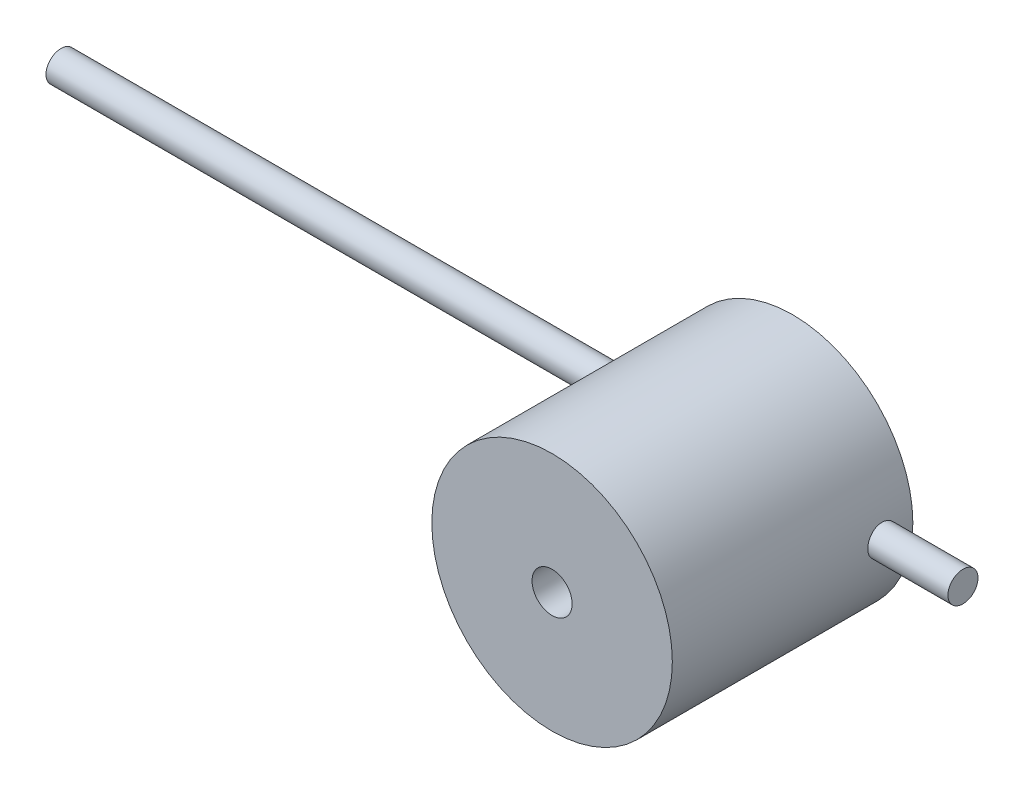
ISO-10303-21;
HEADER;
FILE_DESCRIPTION(('STEP AP214'),'2;1');
FILE_NAME('part.step','',(''),(''),'','','');
FILE_SCHEMA(('AUTOMOTIVE_DESIGN { 1 0 10303 214 1 1 1 1 }'));
ENDSEC;
DATA;
#1=APPLICATION_CONTEXT('core data for automotive mechanical design processes');
#2=APPLICATION_PROTOCOL_DEFINITION('international standard','automotive_design',2000,#1);
#3=PRODUCT_CONTEXT('',#1,'mechanical');
#4=PRODUCT('Part','Part','',(#3));
#5=PRODUCT_RELATED_PRODUCT_CATEGORY('part','',(#4));
#6=PRODUCT_DEFINITION_FORMATION('','',#4);
#7=PRODUCT_DEFINITION_CONTEXT('part definition',#1,'design');
#8=PRODUCT_DEFINITION('design','',#6,#7);
#9=PRODUCT_DEFINITION_SHAPE('','',#8);
#10=(LENGTH_UNIT() NAMED_UNIT(*) SI_UNIT(.MILLI.,.METRE.));
#11=(NAMED_UNIT(*) PLANE_ANGLE_UNIT() SI_UNIT($,.RADIAN.));
#12=(NAMED_UNIT(*) SI_UNIT($,.STERADIAN.) SOLID_ANGLE_UNIT());
#13=UNCERTAINTY_MEASURE_WITH_UNIT(LENGTH_MEASURE(1.E-05),#10,'distance_accuracy_value','');
#14=(GEOMETRIC_REPRESENTATION_CONTEXT(3) GLOBAL_UNCERTAINTY_ASSIGNED_CONTEXT((#13)) GLOBAL_UNIT_ASSIGNED_CONTEXT((#10,
#11,#12)) REPRESENTATION_CONTEXT('',''));
#15=CARTESIAN_POINT('',(0.,0.,0.));
#16=DIRECTION('',(0.,0.,1.));
#17=DIRECTION('',(1.,0.,0.));
#18=AXIS2_PLACEMENT_3D('',#15,#16,#17);
#19=CARTESIAN_POINT('',(0.,0.,120.));
#20=DIRECTION('',(0.,0.,-1.));
#21=DIRECTION('',(-1.,0.,0.));
#22=AXIS2_PLACEMENT_3D('',#19,#20,#21);
#23=CYLINDRICAL_SURFACE('',#22,60.);
#24=CARTESIAN_POINT('',(-60.,0.,22.5));
#25=CARTESIAN_POINT('',(-60.0000008072456,-0.209835179857693,22.5000024081655));
#26=CARTESIAN_POINT('',(-59.9988970627432,-0.419635008083124,22.4911906957988));
#27=CARTESIAN_POINT('',(-59.994514648571,-0.837801219709847,22.4560115216013));
#28=CARTESIAN_POINT('',(-59.9912354859298,-1.04616726738617,22.4296400805553));
#29=CARTESIAN_POINT('',(-59.9825900581494,-1.46006185394668,22.3595051153471));
#30=CARTESIAN_POINT('',(-59.977222238961,-1.66558816175998,22.3157286405702));
#31=CARTESIAN_POINT('',(-59.9645488785549,-2.07226432319807,22.2110899652084));
#32=CARTESIAN_POINT('',(-59.9572426276364,-2.27341254466818,22.1502215064098));
#33=CARTESIAN_POINT('',(-59.940907480883,-2.66962301929384,22.0119252044326));
#34=CARTESIAN_POINT('',(-59.9318803976571,-2.86469142718654,21.9345147751655));
#35=CARTESIAN_POINT('',(-59.9123479560362,-3.2476673905735,21.7636263282448));
#36=CARTESIAN_POINT('',(-59.9018420534441,-3.43557227743676,21.6701423928142));
#37=CARTESIAN_POINT('',(-59.879654390666,-3.80273620040454,21.4678517612572));
#38=CARTESIAN_POINT('',(-59.8679732777265,-3.98199991602831,21.3590534864614));
#39=CARTESIAN_POINT('',(-59.8437516261297,-4.3308167277805,21.1268217112452));
#40=CARTESIAN_POINT('',(-59.8312107700279,-4.50036619421962,21.0033827926191));
#41=CARTESIAN_POINT('',(-59.8055648124258,-4.82926021024783,20.7421726246075));
#42=CARTESIAN_POINT('',(-59.7924574043078,-4.9885548453394,20.6043387500643));
#43=CARTESIAN_POINT('',(-59.7660958398318,-5.29504112974239,20.3157186594682));
#44=CARTESIAN_POINT('',(-59.7528416309941,-5.4422282811684,20.1649276720497));
#45=CARTESIAN_POINT('',(-59.7265690908328,-5.72336233151058,19.851538085621));
#46=CARTESIAN_POINT('',(-59.713550686116,-5.85731341001309,19.6889432422568));
#47=CARTESIAN_POINT('',(-59.6881086091899,-6.11113500812857,19.3529726204506));
#48=CARTESIAN_POINT('',(-59.6756851581607,-6.23100031491878,19.1795928868416));
#49=CARTESIAN_POINT('',(-59.6517527193942,-6.45610218120676,18.8227461899607));
#50=CARTESIAN_POINT('',(-59.6402467724814,-6.56129089761476,18.6392488374808));
#51=CARTESIAN_POINT('',(-59.6185237847686,-6.75582760386391,18.2639645314929));
#52=CARTESIAN_POINT('',(-59.6083067586298,-6.84517541352051,18.0721774837235));
#53=CARTESIAN_POINT('',(-59.5894571244349,-7.00737256545688,17.6816833496951));
#54=CARTESIAN_POINT('',(-59.580824444309,-7.08022265822985,17.4829765786939));
#55=CARTESIAN_POINT('',(-59.5653933051776,-7.20889193973476,17.0800491725216));
#56=CARTESIAN_POINT('',(-59.5585948786415,-7.26471082698702,16.875828439814));
#57=CARTESIAN_POINT('',(-59.5470621441925,-7.35864259084453,16.4644613909454));
#58=CARTESIAN_POINT('',(-59.5423168587649,-7.39684970581958,16.2573369041406));
#59=CARTESIAN_POINT('',(-59.534972875091,-7.4557281728748,15.8405025481861));
#60=CARTESIAN_POINT('',(-59.5323749194834,-7.47639345830551,15.6307918100268));
#61=CARTESIAN_POINT('',(-59.529405895952,-7.49999961317464,15.2104278964538));
#62=CARTESIAN_POINT('',(-59.5290339473656,-7.50294749205367,14.9997751267438));
#63=CARTESIAN_POINT('',(-59.5305203499227,-7.49113569056481,14.5789534994092));
#64=CARTESIAN_POINT('',(-59.532379522847,-7.47636948563487,14.3687848486724));
#65=CARTESIAN_POINT('',(-59.5412131240585,-7.40585434457932,13.7438353326807));
#66=CARTESIAN_POINT('',(-59.5514243347812,-7.32404699514045,13.3317219858392));
#67=CARTESIAN_POINT('',(-59.5793747967333,-7.09305044334548,12.5273479905467));
#68=CARTESIAN_POINT('',(-59.5971142004878,-6.94385987576682,12.13508774451));
#69=CARTESIAN_POINT('',(-59.6381737977105,-6.58189686974764,11.3800140139334));
#70=CARTESIAN_POINT('',(-59.6615092825892,-6.36894981211383,11.0172849263981));
#71=CARTESIAN_POINT('',(-59.7111212566682,-5.8856443573775,10.3325750893944));
#72=CARTESIAN_POINT('',(-59.7373978803633,-5.61528333429471,10.0105962048202));
#73=CARTESIAN_POINT('',(-59.7901533200798,-5.02259734630539,9.41417317405978));
#74=CARTESIAN_POINT('',(-59.8166322779516,-4.69992602818961,9.14007307332733));
#75=CARTESIAN_POINT('',(-59.8666389703307,-4.01297150267218,8.64987301128228));
#76=CARTESIAN_POINT('',(-59.8901666980328,-3.64868819932049,8.43377318371211));
#77=CARTESIAN_POINT('',(-59.9316345685704,-2.88858501872626,8.06570612690976));
#78=CARTESIAN_POINT('',(-59.9495728337504,-2.4927545998868,7.91376044276152));
#79=CARTESIAN_POINT('',(-59.9778235716976,-1.68092380742017,7.67858851502524));
#80=CARTESIAN_POINT('',(-59.9881364014722,-1.26492437903667,7.59535905426251));
#81=CARTESIAN_POINT('',(-59.9999278970946,-0.427539542256187,7.50042765701667));
#82=CARTESIAN_POINT('',(-60.001465101621,-0.00620865829554948,7.48825173869244));
#83=CARTESIAN_POINT('',(-59.9956901228213,0.832488297188223,7.53452348637715));
#84=CARTESIAN_POINT('',(-59.9883781279523,1.24985445295551,7.59296964838118));
#85=CARTESIAN_POINT('',(-59.9657631270826,2.06737282520474,7.77842806320245));
#86=CARTESIAN_POINT('',(-59.9504864642922,2.46757711048676,7.90521432705758));
#87=CARTESIAN_POINT('',(-59.9136514531216,3.2410515654509,8.22353631902365));
#88=CARTESIAN_POINT('',(-59.8920928914514,3.61432082006805,8.41507424569011));
#89=CARTESIAN_POINT('',(-59.8449555870866,4.32540380634226,8.85854454603988));
#90=CARTESIAN_POINT('',(-59.8193566873232,4.66302478410743,9.11078325443115));
#91=CARTESIAN_POINT('',(-59.7670509035881,5.29142746605191,9.66830410979636));
#92=CARTESIAN_POINT('',(-59.7403439756681,5.58220731010574,9.97358836228121));
#93=CARTESIAN_POINT('',(-59.7016380435985,5.97763907410765,10.4653937662025));
#94=CARTESIAN_POINT('',(-59.6889214637685,6.10301121551393,10.6356038298914));
#95=CARTESIAN_POINT('',(-59.6643241588947,6.3389644858848,10.9860168100064));
#96=CARTESIAN_POINT('',(-59.6524431268586,6.44955106087969,11.1662160123022));
#97=CARTESIAN_POINT('',(-59.6298530585349,6.65517392472868,11.5354154663655));
#98=CARTESIAN_POINT('',(-59.6191444320137,6.75020478242911,11.7244187625516));
#99=CARTESIAN_POINT('',(-59.5992146694418,6.9239625838002,12.1097765980105));
#100=CARTESIAN_POINT('',(-59.5899930068333,7.00269530171975,12.3061285045402));
#101=CARTESIAN_POINT('',(-59.5733202297058,7.14314431617409,12.7043603211244));
#102=CARTESIAN_POINT('',(-59.565864856219,7.20490160362171,12.9062255974062));
#103=CARTESIAN_POINT('',(-59.5529117083577,7.31119531531366,13.3144979850567));
#104=CARTESIAN_POINT('',(-59.547413888697,7.35573213793778,13.5209049912399));
#105=CARTESIAN_POINT('',(-59.5385356216265,7.4272523237877,13.9367790558483));
#106=CARTESIAN_POINT('',(-59.5351551310154,7.45423604516084,14.1462460517494));
#107=CARTESIAN_POINT('',(-59.5306100233168,7.49044756561786,14.5667295608509));
#108=CARTESIAN_POINT('',(-59.5294453610939,7.49967572637343,14.7777460424012));
#109=CARTESIAN_POINT('',(-59.5293660224746,7.50030533841579,15.1983775271006));
#110=CARTESIAN_POINT('',(-59.530436183503,7.49182692324543,15.4079923574669));
#111=CARTESIAN_POINT('',(-59.5347642243482,7.45735539030996,15.82568027398));
#112=CARTESIAN_POINT('',(-59.5380213387001,7.43136840078462,16.033753873825));
#113=CARTESIAN_POINT('',(-59.5466296196732,7.36207293039528,16.4469906883013));
#114=CARTESIAN_POINT('',(-59.5519811660099,7.31876130858647,16.6521533681967));
#115=CARTESIAN_POINT('',(-59.5646246440456,7.21513769662506,17.0580730004122));
#116=CARTESIAN_POINT('',(-59.571916534734,7.15482606577807,17.2588300457513));
#117=CARTESIAN_POINT('',(-59.5882296253959,7.01766726108854,17.6544614075487));
#118=CARTESIAN_POINT('',(-59.5972502188397,6.94082588568978,17.8493377596216));
#119=CARTESIAN_POINT('',(-59.6167661080843,6.77115104009003,18.2319194119574));
#120=CARTESIAN_POINT('',(-59.6272613895109,6.67831772576611,18.4196247820957));
#121=CARTESIAN_POINT('',(-59.6494324317321,6.47730127639786,18.7866009062649));
#122=CARTESIAN_POINT('',(-59.6611084172704,6.36911521741458,18.9658700449306));
#123=CARTESIAN_POINT('',(-59.6853066624681,6.13821094064496,19.3146367258618));
#124=CARTESIAN_POINT('',(-59.6978286170115,6.01549795040788,19.4841377507564));
#125=CARTESIAN_POINT('',(-59.7234625843333,5.7554496986455,19.8134314802167));
#126=CARTESIAN_POINT('',(-59.7365781324208,5.61801751874011,19.9731473817028));
#127=CARTESIAN_POINT('',(-59.7629410448537,5.3302662011054,20.2803926701648));
#128=CARTESIAN_POINT('',(-59.7761883596875,5.17995175340545,20.4279264541806));
#129=CARTESIAN_POINT('',(-59.8024544864036,4.86734515160091,20.7099290359168));
#130=CARTESIAN_POINT('',(-59.8154731554797,4.70504581984004,20.8443898908543));
#131=CARTESIAN_POINT('',(-59.8409024794371,4.36974177688067,21.0991535565568));
#132=CARTESIAN_POINT('',(-59.8533133571354,4.1967410422719,21.2194615787939));
#133=CARTESIAN_POINT('',(-59.8772329933241,3.84043950279135,21.4455978230118));
#134=CARTESIAN_POINT('',(-59.8887377589692,3.65709862113597,21.5513633382413));
#135=CARTESIAN_POINT('',(-59.9104562841461,3.2821453310284,21.747016013278));
#136=CARTESIAN_POINT('',(-59.9206705169112,3.09053598936716,21.8369089983135));
#137=CARTESIAN_POINT('',(-59.9395148754504,2.70048792706706,22.000144229784));
#138=CARTESIAN_POINT('',(-59.9481462359873,2.50205467434842,22.0734993873387));
#139=CARTESIAN_POINT('',(-59.9635872434483,2.09970302756128,22.2031888157386));
#140=CARTESIAN_POINT('',(-59.9703973200369,1.89578593971624,22.2595271014923));
#141=CARTESIAN_POINT('',(-59.9839939841766,1.41313252163123,22.371135728674));
#142=CARTESIAN_POINT('',(-59.9899711348981,1.1327263466371,22.4194100878781));
#143=CARTESIAN_POINT('',(-59.9979735818365,0.568191833988667,22.483840475098));
#144=CARTESIAN_POINT('',(-59.9999989071945,0.284063523797303,22.4999967399557));
#145=CARTESIAN_POINT('',(-60.,0.,22.5));
#146=B_SPLINE_CURVE_WITH_KNOTS('',3,(#24,#25,#26,#27,#28,#29,#30,#31,#32,#33,#34,#35,#36,#37,
#38,#39,#40,#41,#42,#43,#44,#45,#46,#47,#48,#49,#50,#51,#52,#53,#54,#55,#56,#57,#58,#59,#60,#61,
#62,#63,#64,#65,#66,#67,#68,#69,#70,#71,#72,#73,#74,#75,#76,#77,#78,#79,#80,#81,#82,#83,#84,#85,
#86,#87,#88,#89,#90,#91,#92,#93,#94,#95,#96,#97,#98,#99,#100,#101,#102,#103,#104,#105,#106,#107,
#108,#109,#110,#111,#112,#113,#114,#115,#116,#117,#118,#119,#120,#121,#122,#123,#124,#125,#126,
#127,#128,#129,#130,#131,#132,#133,#134,#135,#136,#137,#138,#139,#140,#141,#142,#143,#144,#145),
.UNSPECIFIED.,.T.,.F.,(4,2,2,2,2,2,2,2,2,2,2,2,2,2,2,2,2,2,2,2,2,2,2,2,2,2,2,2,2,2,2,2,2,2,2,2,
2,2,2,2,2,2,2,2,2,2,2,2,2,2,2,2,2,2,2,2,2,2,2,2,4),(0.,0.629256956735979,1.25865655812087,
1.88852535779791,2.51862508473088,3.14806473809473,3.777736630198,4.40706360970477,
5.03662422138718,5.66904783479461,6.30170534005458,6.93416242680935,7.56685283927394,
8.20155979243648,8.83627396469675,9.47095925754273,10.1056557846852,10.7369155393907,
11.3683935195212,11.9996216550207,12.631082359814,13.8854341565249,15.1398113682614,
16.3976560518401,17.6555582786833,18.9221576073666,20.1887598566675,21.4557871352223,
22.7227550903875,23.9812616450318,25.239741398332,26.494084880076,27.7484709556426,
29.0093253511268,30.2702298045268,30.9049539441184,31.5394436451943,32.1741544029163,
32.8086399033805,33.4415795637905,34.0745045808413,34.7074166835062,35.3403158939383,
35.9689350363351,36.5973342676854,37.2258474790913,37.8543474074806,38.4826272238218,
39.1109009165237,39.739294425292,40.3674624887028,41.0000557512051,41.6324196768415,
42.2651654408618,42.8976774758577,43.5328366425547,44.1677622187433,44.8021903772161,
45.4364687335205,46.2883290686284,47.1401831220126),.UNSPECIFIED.);
#147=CARTESIAN_POINT('',(-60.,0.,22.5));
#148=VERTEX_POINT('',#147);
#149=EDGE_CURVE('E64',#148,#148,#146,.T.);
#150=ORIENTED_EDGE('',*,*,#149,.T.);
#151=EDGE_LOOP('',(#150));
#152=FACE_BOUND('',#151,.T.);
#153=CARTESIAN_POINT('',(0.,0.,120.));
#154=DIRECTION('',(0.,0.,1.));
#155=DIRECTION('',(1.,0.,0.));
#156=AXIS2_PLACEMENT_3D('',#153,#154,#155);
#157=CIRCLE('',#156,60.);
#158=CARTESIAN_POINT('',(60.,0.,120.));
#159=VERTEX_POINT('',#158);
#160=EDGE_CURVE('E53',#159,#159,#157,.T.);
#161=ORIENTED_EDGE('',*,*,#160,.F.);
#162=EDGE_LOOP('',(#161));
#163=FACE_BOUND('',#162,.T.);
#164=CARTESIAN_POINT('',(0.,0.,0.));
#165=DIRECTION('',(0.,0.,1.));
#166=DIRECTION('',(1.,0.,0.));
#167=AXIS2_PLACEMENT_3D('',#164,#165,#166);
#168=CIRCLE('',#167,60.);
#169=CARTESIAN_POINT('',(60.,0.,0.));
#170=VERTEX_POINT('',#169);
#171=EDGE_CURVE('E58',#170,#170,#168,.T.);
#172=ORIENTED_EDGE('',*,*,#171,.T.);
#173=EDGE_LOOP('',(#172));
#174=FACE_BOUND('',#173,.T.);
#175=CARTESIAN_POINT('',(60.,0.,22.5));
#176=CARTESIAN_POINT('',(60.0000008072456,-0.209835179857693,22.5000024081655));
#177=CARTESIAN_POINT('',(59.9988970627432,-0.419635008083124,22.4911906957988));
#178=CARTESIAN_POINT('',(59.994514648571,-0.837801219709847,22.4560115216013));
#179=CARTESIAN_POINT('',(59.9912354859298,-1.04616726738617,22.4296400805553));
#180=CARTESIAN_POINT('',(59.9825900581494,-1.46006185394668,22.3595051153471));
#181=CARTESIAN_POINT('',(59.977222238961,-1.66558816175998,22.3157286405702));
#182=CARTESIAN_POINT('',(59.9645488785549,-2.07226432319807,22.2110899652084));
#183=CARTESIAN_POINT('',(59.9572426276364,-2.27341254466818,22.1502215064098));
#184=CARTESIAN_POINT('',(59.940907480883,-2.66962301929384,22.0119252044326));
#185=CARTESIAN_POINT('',(59.9318803976571,-2.86469142718654,21.9345147751655));
#186=CARTESIAN_POINT('',(59.9123479560362,-3.2476673905735,21.7636263282448));
#187=CARTESIAN_POINT('',(59.9018420534441,-3.43557227743676,21.6701423928142));
#188=CARTESIAN_POINT('',(59.879654390666,-3.80273620040454,21.4678517612572));
#189=CARTESIAN_POINT('',(59.8679732777265,-3.98199991602831,21.3590534864614));
#190=CARTESIAN_POINT('',(59.8437516261297,-4.3308167277805,21.1268217112452));
#191=CARTESIAN_POINT('',(59.8312107700279,-4.50036619421962,21.0033827926191));
#192=CARTESIAN_POINT('',(59.8055648124258,-4.82926021024783,20.7421726246075));
#193=CARTESIAN_POINT('',(59.7924574043078,-4.9885548453394,20.6043387500643));
#194=CARTESIAN_POINT('',(59.7660958398318,-5.29504112974239,20.3157186594682));
#195=CARTESIAN_POINT('',(59.7528416309941,-5.4422282811684,20.1649276720497));
#196=CARTESIAN_POINT('',(59.7265690908328,-5.72336233151058,19.851538085621));
#197=CARTESIAN_POINT('',(59.713550686116,-5.85731341001309,19.6889432422568));
#198=CARTESIAN_POINT('',(59.6881086091899,-6.11113500812857,19.3529726204506));
#199=CARTESIAN_POINT('',(59.6756851581607,-6.23100031491878,19.1795928868416));
#200=CARTESIAN_POINT('',(59.6517527193942,-6.45610218120676,18.8227461899607));
#201=CARTESIAN_POINT('',(59.6402467724814,-6.56129089761476,18.6392488374808));
#202=CARTESIAN_POINT('',(59.6185237847686,-6.75582760386391,18.2639645314929));
#203=CARTESIAN_POINT('',(59.6083067586298,-6.84517541352051,18.0721774837235));
#204=CARTESIAN_POINT('',(59.5894571244349,-7.00737256545688,17.6816833496951));
#205=CARTESIAN_POINT('',(59.580824444309,-7.08022265822985,17.4829765786939));
#206=CARTESIAN_POINT('',(59.5653933051776,-7.20889193973476,17.0800491725216));
#207=CARTESIAN_POINT('',(59.5585948786415,-7.26471082698702,16.875828439814));
#208=CARTESIAN_POINT('',(59.5470621441925,-7.35864259084453,16.4644613909454));
#209=CARTESIAN_POINT('',(59.5423168587649,-7.39684970581958,16.2573369041406));
#210=CARTESIAN_POINT('',(59.534972875091,-7.4557281728748,15.8405025481861));
#211=CARTESIAN_POINT('',(59.5323749194834,-7.47639345830551,15.6307918100268));
#212=CARTESIAN_POINT('',(59.529405895952,-7.49999961317464,15.2104278964538));
#213=CARTESIAN_POINT('',(59.5290339473656,-7.50294749205367,14.9997751267438));
#214=CARTESIAN_POINT('',(59.5305203499227,-7.49113569056481,14.5789534994092));
#215=CARTESIAN_POINT('',(59.532379522847,-7.47636948563487,14.3687848486724));
#216=CARTESIAN_POINT('',(59.5412131240585,-7.40585434457932,13.7438353326807));
#217=CARTESIAN_POINT('',(59.5514243347812,-7.32404699514045,13.3317219858392));
#218=CARTESIAN_POINT('',(59.5793747967333,-7.09305044334548,12.5273479905467));
#219=CARTESIAN_POINT('',(59.5971142004878,-6.94385987576682,12.13508774451));
#220=CARTESIAN_POINT('',(59.6381737977105,-6.58189686974764,11.3800140139334));
#221=CARTESIAN_POINT('',(59.6615092825892,-6.36894981211383,11.0172849263981));
#222=CARTESIAN_POINT('',(59.7111212566682,-5.8856443573775,10.3325750893944));
#223=CARTESIAN_POINT('',(59.7373978803633,-5.61528333429471,10.0105962048202));
#224=CARTESIAN_POINT('',(59.7901533200798,-5.02259734630539,9.41417317405978));
#225=CARTESIAN_POINT('',(59.8166322779516,-4.69992602818961,9.14007307332733));
#226=CARTESIAN_POINT('',(59.8666389703307,-4.01297150267218,8.64987301128228));
#227=CARTESIAN_POINT('',(59.8901666980328,-3.64868819932049,8.43377318371211));
#228=CARTESIAN_POINT('',(59.9316345685704,-2.88858501872626,8.06570612690976));
#229=CARTESIAN_POINT('',(59.9495728337504,-2.4927545998868,7.91376044276152));
#230=CARTESIAN_POINT('',(59.9778235716976,-1.68092380742017,7.67858851502524));
#231=CARTESIAN_POINT('',(59.9881364014722,-1.26492437903667,7.59535905426251));
#232=CARTESIAN_POINT('',(59.9999278970946,-0.427539542256187,7.50042765701667));
#233=CARTESIAN_POINT('',(60.001465101621,-0.00620865829554948,7.48825173869244));
#234=CARTESIAN_POINT('',(59.9956901228213,0.832488297188223,7.53452348637715));
#235=CARTESIAN_POINT('',(59.9883781279523,1.24985445295551,7.59296964838118));
#236=CARTESIAN_POINT('',(59.9657631270826,2.06737282520474,7.77842806320245));
#237=CARTESIAN_POINT('',(59.9504864642922,2.46757711048676,7.90521432705758));
#238=CARTESIAN_POINT('',(59.9136514531216,3.2410515654509,8.22353631902365));
#239=CARTESIAN_POINT('',(59.8920928914514,3.61432082006805,8.41507424569011));
#240=CARTESIAN_POINT('',(59.8449555870866,4.32540380634226,8.85854454603988));
#241=CARTESIAN_POINT('',(59.8193566873232,4.66302478410743,9.11078325443115));
#242=CARTESIAN_POINT('',(59.7670509035881,5.29142746605191,9.66830410979636));
#243=CARTESIAN_POINT('',(59.7403439756681,5.58220731010574,9.97358836228121));
#244=CARTESIAN_POINT('',(59.7016380435985,5.97763907410765,10.4653937662025));
#245=CARTESIAN_POINT('',(59.6889214637685,6.10301121551393,10.6356038298914));
#246=CARTESIAN_POINT('',(59.6643241588947,6.3389644858848,10.9860168100064));
#247=CARTESIAN_POINT('',(59.6524431268586,6.44955106087969,11.1662160123022));
#248=CARTESIAN_POINT('',(59.6298530585349,6.65517392472868,11.5354154663655));
#249=CARTESIAN_POINT('',(59.6191444320137,6.75020478242911,11.7244187625516));
#250=CARTESIAN_POINT('',(59.5992146694418,6.9239625838002,12.1097765980105));
#251=CARTESIAN_POINT('',(59.5899930068333,7.00269530171975,12.3061285045402));
#252=CARTESIAN_POINT('',(59.5733202297058,7.14314431617409,12.7043603211244));
#253=CARTESIAN_POINT('',(59.565864856219,7.20490160362171,12.9062255974062));
#254=CARTESIAN_POINT('',(59.5529117083577,7.31119531531366,13.3144979850567));
#255=CARTESIAN_POINT('',(59.547413888697,7.35573213793778,13.5209049912399));
#256=CARTESIAN_POINT('',(59.5385356216265,7.4272523237877,13.9367790558483));
#257=CARTESIAN_POINT('',(59.5351551310154,7.45423604516084,14.1462460517494));
#258=CARTESIAN_POINT('',(59.5306100233168,7.49044756561786,14.5667295608509));
#259=CARTESIAN_POINT('',(59.5294453610939,7.49967572637343,14.7777460424012));
#260=CARTESIAN_POINT('',(59.5293660224746,7.50030533841579,15.1983775271006));
#261=CARTESIAN_POINT('',(59.530436183503,7.49182692324543,15.4079923574669));
#262=CARTESIAN_POINT('',(59.5347642243482,7.45735539030996,15.82568027398));
#263=CARTESIAN_POINT('',(59.5380213387001,7.43136840078462,16.033753873825));
#264=CARTESIAN_POINT('',(59.5466296196732,7.36207293039528,16.4469906883013));
#265=CARTESIAN_POINT('',(59.5519811660099,7.31876130858647,16.6521533681967));
#266=CARTESIAN_POINT('',(59.5646246440456,7.21513769662506,17.0580730004122));
#267=CARTESIAN_POINT('',(59.571916534734,7.15482606577807,17.2588300457513));
#268=CARTESIAN_POINT('',(59.5882296253959,7.01766726108854,17.6544614075487));
#269=CARTESIAN_POINT('',(59.5972502188397,6.94082588568978,17.8493377596216));
#270=CARTESIAN_POINT('',(59.6167661080843,6.77115104009003,18.2319194119574));
#271=CARTESIAN_POINT('',(59.6272613895109,6.67831772576611,18.4196247820957));
#272=CARTESIAN_POINT('',(59.6494324317321,6.47730127639786,18.7866009062649));
#273=CARTESIAN_POINT('',(59.6611084172704,6.36911521741458,18.9658700449306));
#274=CARTESIAN_POINT('',(59.6853066624681,6.13821094064496,19.3146367258618));
#275=CARTESIAN_POINT('',(59.6978286170115,6.01549795040788,19.4841377507564));
#276=CARTESIAN_POINT('',(59.7234625843333,5.7554496986455,19.8134314802167));
#277=CARTESIAN_POINT('',(59.7365781324208,5.61801751874011,19.9731473817028));
#278=CARTESIAN_POINT('',(59.7629410448537,5.3302662011054,20.2803926701648));
#279=CARTESIAN_POINT('',(59.7761883596875,5.17995175340545,20.4279264541806));
#280=CARTESIAN_POINT('',(59.8024544864036,4.86734515160091,20.7099290359168));
#281=CARTESIAN_POINT('',(59.8154731554797,4.70504581984004,20.8443898908543));
#282=CARTESIAN_POINT('',(59.8409024794371,4.36974177688067,21.0991535565568));
#283=CARTESIAN_POINT('',(59.8533133571354,4.1967410422719,21.2194615787939));
#284=CARTESIAN_POINT('',(59.8772329933241,3.84043950279135,21.4455978230118));
#285=CARTESIAN_POINT('',(59.8887377589692,3.65709862113597,21.5513633382413));
#286=CARTESIAN_POINT('',(59.9104562841461,3.2821453310284,21.747016013278));
#287=CARTESIAN_POINT('',(59.9206705169112,3.09053598936716,21.8369089983135));
#288=CARTESIAN_POINT('',(59.9395148754504,2.70048792706706,22.000144229784));
#289=CARTESIAN_POINT('',(59.9481462359873,2.50205467434842,22.0734993873387));
#290=CARTESIAN_POINT('',(59.9635872434483,2.09970302756128,22.2031888157386));
#291=CARTESIAN_POINT('',(59.9703973200369,1.89578593971624,22.2595271014923));
#292=CARTESIAN_POINT('',(59.9839939841766,1.41313252163123,22.371135728674));
#293=CARTESIAN_POINT('',(59.9899711348981,1.1327263466371,22.4194100878781));
#294=CARTESIAN_POINT('',(59.9979735818365,0.568191833988667,22.483840475098));
#295=CARTESIAN_POINT('',(59.9999989071945,0.284063523797303,22.4999967399557));
#296=CARTESIAN_POINT('',(60.,0.,22.5));
#297=B_SPLINE_CURVE_WITH_KNOTS('',3,(#175,#176,#177,#178,#179,#180,#181,#182,#183,#184,#185,
#186,#187,#188,#189,#190,#191,#192,#193,#194,#195,#196,#197,#198,#199,#200,#201,#202,#203,#204,
#205,#206,#207,#208,#209,#210,#211,#212,#213,#214,#215,#216,#217,#218,#219,#220,#221,#222,#223,
#224,#225,#226,#227,#228,#229,#230,#231,#232,#233,#234,#235,#236,#237,#238,#239,#240,#241,#242,
#243,#244,#245,#246,#247,#248,#249,#250,#251,#252,#253,#254,#255,#256,#257,#258,#259,#260,#261,
#262,#263,#264,#265,#266,#267,#268,#269,#270,#271,#272,#273,#274,#275,#276,#277,#278,#279,#280,
#281,#282,#283,#284,#285,#286,#287,#288,#289,#290,#291,#292,#293,#294,#295,#296),.UNSPECIFIED.,
.T.,.F.,(4,2,2,2,2,2,2,2,2,2,2,2,2,2,2,2,2,2,2,2,2,2,2,2,2,2,2,2,2,2,2,2,2,2,2,2,2,2,2,2,2,2,2,
2,2,2,2,2,2,2,2,2,2,2,2,2,2,2,2,2,4),(0.,0.629256956735979,1.25865655812087,1.88852535779791,
2.51862508473088,3.14806473809473,3.777736630198,4.40706360970477,5.03662422138718,
5.66904783479461,6.30170534005458,6.93416242680935,7.56685283927394,8.20155979243648,
8.83627396469675,9.47095925754273,10.1056557846852,10.7369155393907,11.3683935195212,
11.9996216550207,12.631082359814,13.8854341565249,15.1398113682614,16.3976560518401,
17.6555582786833,18.9221576073666,20.1887598566675,21.4557871352223,22.7227550903875,
23.9812616450318,25.239741398332,26.494084880076,27.7484709556426,29.0093253511268,
30.2702298045268,30.9049539441184,31.5394436451943,32.1741544029163,32.8086399033805,
33.4415795637905,34.0745045808413,34.7074166835062,35.3403158939383,35.9689350363351,
36.5973342676854,37.2258474790913,37.8543474074806,38.4826272238218,39.1109009165237,
39.739294425292,40.3674624887028,41.0000557512051,41.6324196768415,42.2651654408618,
42.8976774758577,43.5328366425547,44.1677622187433,44.8021903772161,45.4364687335205,
46.2883290686284,47.1401831220126),.UNSPECIFIED.);
#298=CARTESIAN_POINT('',(60.,0.,22.5));
#299=VERTEX_POINT('',#298);
#300=EDGE_CURVE('E10',#299,#299,#297,.T.);
#301=ORIENTED_EDGE('',*,*,#300,.F.);
#302=EDGE_LOOP('',(#301));
#303=FACE_BOUND('',#302,.T.);
#304=ADVANCED_FACE('F41',(#152,#163,#174,#303),#23,.T.);
#305=CARTESIAN_POINT('',(0.,0.,120.));
#306=DIRECTION('',(0.,0.,1.));
#307=DIRECTION('',(1.,0.,0.));
#308=AXIS2_PLACEMENT_3D('',#305,#306,#307);
#309=PLANE('',#308);
#310=CARTESIAN_POINT('',(0.,0.,120.));
#311=DIRECTION('',(0.,0.,1.));
#312=DIRECTION('',(1.,0.,0.));
#313=AXIS2_PLACEMENT_3D('',#310,#311,#312);
#314=CIRCLE('',#313,10.);
#315=CARTESIAN_POINT('',(10.,0.,120.));
#316=VERTEX_POINT('',#315);
#317=EDGE_CURVE('E180',#316,#316,#314,.T.);
#318=ORIENTED_EDGE('',*,*,#317,.F.);
#319=EDGE_LOOP('',(#318));
#320=FACE_BOUND('',#319,.T.);
#321=ORIENTED_EDGE('',*,*,#160,.T.);
#322=EDGE_LOOP('',(#321));
#323=FACE_BOUND('',#322,.T.);
#324=ADVANCED_FACE('F84',(#320,#323),#309,.T.);
#325=CARTESIAN_POINT('',(0.,0.,0.));
#326=DIRECTION('',(0.,0.,1.));
#327=DIRECTION('',(1.,0.,0.));
#328=AXIS2_PLACEMENT_3D('',#325,#326,#327);
#329=PLANE('',#328);
#330=CARTESIAN_POINT('',(0.,0.,0.));
#331=DIRECTION('',(0.,0.,1.));
#332=DIRECTION('',(1.,0.,0.));
#333=AXIS2_PLACEMENT_3D('',#330,#331,#332);
#334=CIRCLE('',#333,10.);
#335=CARTESIAN_POINT('',(10.,0.,0.));
#336=VERTEX_POINT('',#335);
#337=EDGE_CURVE('E178',#336,#336,#334,.T.);
#338=ORIENTED_EDGE('',*,*,#337,.T.);
#339=EDGE_LOOP('',(#338));
#340=FACE_BOUND('',#339,.T.);
#341=ORIENTED_EDGE('',*,*,#171,.F.);
#342=EDGE_LOOP('',(#341));
#343=FACE_BOUND('',#342,.T.);
#344=ADVANCED_FACE('F81',(#340,#343),#329,.F.);
#345=CARTESIAN_POINT('',(-350.,0.,15.));
#346=DIRECTION('',(1.,0.,0.));
#347=DIRECTION('',(0.,0.,-1.));
#348=AXIS2_PLACEMENT_3D('',#345,#346,#347);
#349=CYLINDRICAL_SURFACE('',#348,7.5);
#350=CARTESIAN_POINT('',(-350.,0.,15.));
#351=DIRECTION('',(1.,0.,0.));
#352=DIRECTION('',(0.,0.,-1.));
#353=AXIS2_PLACEMENT_3D('',#350,#351,#352);
#354=CIRCLE('',#353,7.5);
#355=CARTESIAN_POINT('',(-350.,0.,7.5));
#356=VERTEX_POINT('',#355);
#357=EDGE_CURVE('E67',#356,#356,#354,.T.);
#358=ORIENTED_EDGE('',*,*,#357,.T.);
#359=EDGE_LOOP('',(#358));
#360=FACE_BOUND('',#359,.T.);
#361=ORIENTED_EDGE('',*,*,#149,.F.);
#362=EDGE_LOOP('',(#361));
#363=FACE_BOUND('',#362,.T.);
#364=ADVANCED_FACE('F75',(#360,#363),#349,.T.);
#365=CARTESIAN_POINT('',(-350.,0.,15.));
#366=DIRECTION('',(1.,0.,0.));
#367=DIRECTION('',(0.,0.,-1.));
#368=AXIS2_PLACEMENT_3D('',#365,#366,#367);
#369=PLANE('',#368);
#370=ORIENTED_EDGE('',*,*,#357,.F.);
#371=EDGE_LOOP('',(#370));
#372=FACE_BOUND('',#371,.T.);
#373=ADVANCED_FACE('F80',(#372),#369,.F.);
#374=CARTESIAN_POINT('',(0.,0.,0.));
#375=DIRECTION('',(0.,0.,1.));
#376=DIRECTION('',(1.,0.,0.));
#377=AXIS2_PLACEMENT_3D('',#374,#375,#376);
#378=CYLINDRICAL_SURFACE('',#377,10.);
#379=ORIENTED_EDGE('',*,*,#337,.F.);
#380=EDGE_LOOP('',(#379));
#381=FACE_BOUND('',#380,.T.);
#382=ORIENTED_EDGE('',*,*,#317,.T.);
#383=EDGE_LOOP('',(#382));
#384=FACE_BOUND('',#383,.T.);
#385=ADVANCED_FACE('F125',(#381,#384),#378,.F.);
#386=CARTESIAN_POINT('',(100.,0.,15.));
#387=DIRECTION('',(-1.,0.,0.));
#388=DIRECTION('',(0.,0.,1.));
#389=AXIS2_PLACEMENT_3D('',#386,#387,#388);
#390=CYLINDRICAL_SURFACE('',#389,7.5);
#391=CARTESIAN_POINT('',(100.,0.,15.));
#392=DIRECTION('',(1.,0.,0.));
#393=DIRECTION('',(0.,0.,-1.));
#394=AXIS2_PLACEMENT_3D('',#391,#392,#393);
#395=CIRCLE('',#394,7.5);
#396=CARTESIAN_POINT('',(100.,0.,7.5));
#397=VERTEX_POINT('',#396);
#398=EDGE_CURVE('E185',#397,#397,#395,.T.);
#399=ORIENTED_EDGE('',*,*,#398,.F.);
#400=EDGE_LOOP('',(#399));
#401=FACE_BOUND('',#400,.T.);
#402=ORIENTED_EDGE('',*,*,#300,.T.);
#403=EDGE_LOOP('',(#402));
#404=FACE_BOUND('',#403,.T.);
#405=ADVANCED_FACE('F129',(#401,#404),#390,.T.);
#406=CARTESIAN_POINT('',(100.,0.,15.));
#407=DIRECTION('',(1.,0.,0.));
#408=DIRECTION('',(0.,0.,-1.));
#409=AXIS2_PLACEMENT_3D('',#406,#407,#408);
#410=PLANE('',#409);
#411=ORIENTED_EDGE('',*,*,#398,.T.);
#412=EDGE_LOOP('',(#411));
#413=FACE_BOUND('',#412,.T.);
#414=ADVANCED_FACE('F140',(#413),#410,.T.);
#415=CLOSED_SHELL('',(#304,#324,#344,#364,#373,#385,#405,#414));
#416=MANIFOLD_SOLID_BREP('B2',#415);
#417=ADVANCED_BREP_SHAPE_REPRESENTATION('',(#18,#416),#14);
#418=SHAPE_DEFINITION_REPRESENTATION(#9,#417);
ENDSEC;
END-ISO-10303-21;
